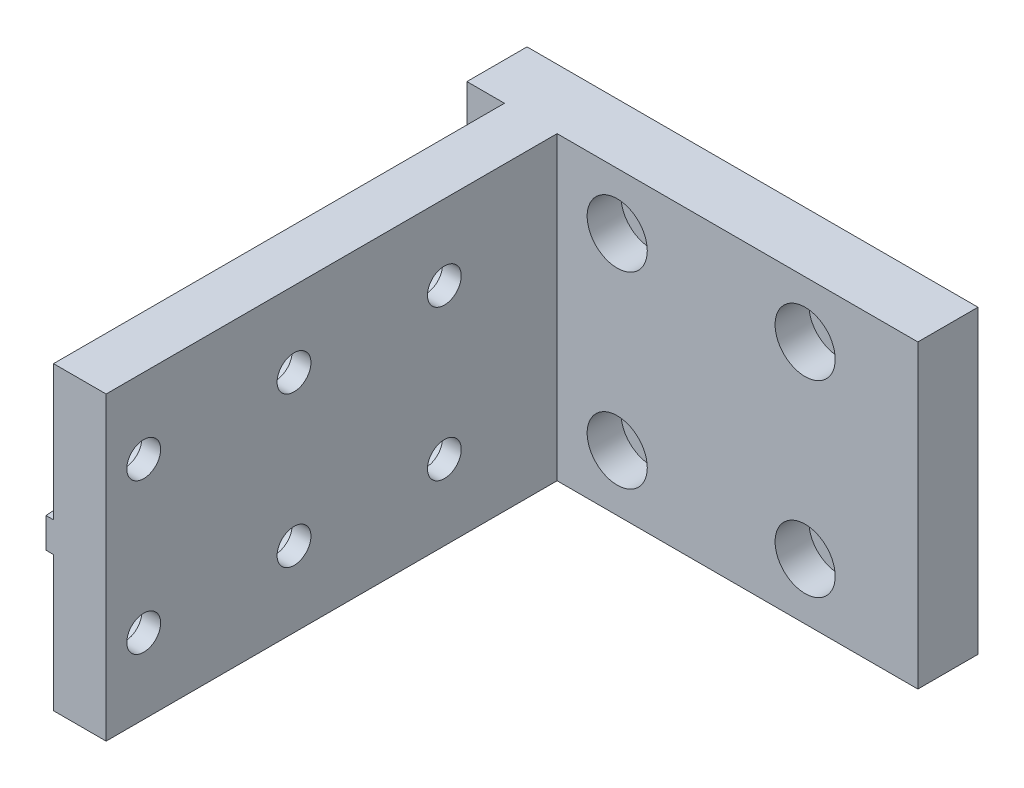
ISO-10303-21;
HEADER;
FILE_DESCRIPTION(('STEP AP214'),'2;1');
FILE_NAME('part.step','',(''),(''),'','','');
FILE_SCHEMA(('AUTOMOTIVE_DESIGN { 1 0 10303 214 1 1 1 1 }'));
ENDSEC;
DATA;
#1=APPLICATION_CONTEXT('core data for automotive mechanical design processes');
#2=APPLICATION_PROTOCOL_DEFINITION('international standard','automotive_design',2000,#1);
#3=PRODUCT_CONTEXT('',#1,'mechanical');
#4=PRODUCT('Part','Part','',(#3));
#5=PRODUCT_RELATED_PRODUCT_CATEGORY('part','',(#4));
#6=PRODUCT_DEFINITION_FORMATION('','',#4);
#7=PRODUCT_DEFINITION_CONTEXT('part definition',#1,'design');
#8=PRODUCT_DEFINITION('design','',#6,#7);
#9=PRODUCT_DEFINITION_SHAPE('','',#8);
#10=(LENGTH_UNIT() NAMED_UNIT(*) SI_UNIT(.MILLI.,.METRE.));
#11=(NAMED_UNIT(*) PLANE_ANGLE_UNIT() SI_UNIT($,.RADIAN.));
#12=(NAMED_UNIT(*) SI_UNIT($,.STERADIAN.) SOLID_ANGLE_UNIT());
#13=UNCERTAINTY_MEASURE_WITH_UNIT(LENGTH_MEASURE(1.E-05),#10,'distance_accuracy_value','');
#14=(GEOMETRIC_REPRESENTATION_CONTEXT(3) GLOBAL_UNCERTAINTY_ASSIGNED_CONTEXT((#13)) GLOBAL_UNIT_ASSIGNED_CONTEXT((#10,
#11,#12)) REPRESENTATION_CONTEXT('',''));
#15=CARTESIAN_POINT('',(0.,0.,0.));
#16=DIRECTION('',(0.,0.,1.));
#17=DIRECTION('',(1.,0.,0.));
#18=AXIS2_PLACEMENT_3D('',#15,#16,#17);
#19=CARTESIAN_POINT('',(0.,0.,8.));
#20=DIRECTION('',(0.,0.,1.));
#21=DIRECTION('',(1.,0.,0.));
#22=AXIS2_PLACEMENT_3D('',#19,#20,#21);
#23=PLANE('',#22);
#24=DIRECTION('',(0.,-1.,0.));
#25=VECTOR('',#24,1.);
#26=CARTESIAN_POINT('',(-30.,20.,8.));
#27=LINE('',#26,#25);
#28=CARTESIAN_POINT('',(-30.,20.,8.));
#29=VERTEX_POINT('',#28);
#30=CARTESIAN_POINT('',(-30.,2.,8.));
#31=VERTEX_POINT('',#30);
#32=EDGE_CURVE('E420',#29,#31,#27,.T.);
#33=ORIENTED_EDGE('',*,*,#32,.T.);
#34=DIRECTION('',(-1.,0.,0.));
#35=VECTOR('',#34,1.);
#36=CARTESIAN_POINT('',(-25.,2.,8.));
#37=LINE('',#36,#35);
#38=CARTESIAN_POINT('',(-25.,2.,8.));
#39=VERTEX_POINT('',#38);
#40=EDGE_CURVE('E167',#39,#31,#37,.T.);
#41=ORIENTED_EDGE('',*,*,#40,.F.);
#42=DIRECTION('',(0.,-1.,0.));
#43=VECTOR('',#42,1.);
#44=CARTESIAN_POINT('',(-25.,-20.,8.));
#45=LINE('',#44,#43);
#46=CARTESIAN_POINT('',(-25.,20.,8.));
#47=VERTEX_POINT('',#46);
#48=EDGE_CURVE('E428',#47,#39,#45,.T.);
#49=ORIENTED_EDGE('',*,*,#48,.F.);
#50=DIRECTION('',(-1.,0.,0.));
#51=VECTOR('',#50,1.);
#52=CARTESIAN_POINT('',(-30.,20.,8.));
#53=LINE('',#52,#51);
#54=EDGE_CURVE('E407',#47,#29,#53,.T.);
#55=ORIENTED_EDGE('',*,*,#54,.T.);
#56=EDGE_LOOP('',(#33,#41,#49,#55));
#57=FACE_BOUND('',#56,.T.);
#58=ADVANCED_FACE('F49',(#57),#23,.T.);
#59=CARTESIAN_POINT('',(-25.,-2.,8.));
#60=VERTEX_POINT('',#59);
#61=CARTESIAN_POINT('',(-25.,-20.,8.));
#62=VERTEX_POINT('',#61);
#63=EDGE_CURVE('E424',#60,#62,#45,.T.);
#64=ORIENTED_EDGE('',*,*,#63,.F.);
#65=DIRECTION('',(1.,0.,0.));
#66=VECTOR('',#65,1.);
#67=CARTESIAN_POINT('',(-30.,-2.,8.));
#68=LINE('',#67,#66);
#69=CARTESIAN_POINT('',(-30.,-2.,8.));
#70=VERTEX_POINT('',#69);
#71=EDGE_CURVE('E67',#70,#60,#68,.T.);
#72=ORIENTED_EDGE('',*,*,#71,.F.);
#73=CARTESIAN_POINT('',(-30.,-20.,8.));
#74=VERTEX_POINT('',#73);
#75=EDGE_CURVE('E412',#70,#74,#27,.T.);
#76=ORIENTED_EDGE('',*,*,#75,.T.);
#77=DIRECTION('',(1.,0.,0.));
#78=VECTOR('',#77,1.);
#79=CARTESIAN_POINT('',(-30.,-20.,8.));
#80=LINE('',#79,#78);
#81=EDGE_CURVE('E415',#74,#62,#80,.T.);
#82=ORIENTED_EDGE('',*,*,#81,.T.);
#83=EDGE_LOOP('',(#64,#72,#76,#82));
#84=FACE_BOUND('',#83,.T.);
#85=ADVANCED_FACE('F331',(#84),#23,.T.);
#86=CARTESIAN_POINT('',(-25.,-20.,68.));
#87=DIRECTION('',(1.,0.,0.));
#88=DIRECTION('',(0.,0.,-1.));
#89=AXIS2_PLACEMENT_3D('',#86,#87,#88);
#90=PLANE('',#89);
#91=CARTESIAN_POINT('',(-25.,-10.,63.));
#92=DIRECTION('',(-1.,0.,0.));
#93=DIRECTION('',(0.,0.,1.));
#94=AXIS2_PLACEMENT_3D('',#91,#92,#93);
#95=CIRCLE('',#94,4.00000000000001);
#96=CARTESIAN_POINT('',(-25.,-10.,67.));
#97=VERTEX_POINT('',#96);
#98=EDGE_CURVE('E593',#97,#97,#95,.T.);
#99=ORIENTED_EDGE('',*,*,#98,.F.);
#100=EDGE_LOOP('',(#99));
#101=FACE_BOUND('',#100,.T.);
#102=CARTESIAN_POINT('',(-25.,-10.,23.));
#103=DIRECTION('',(-1.,0.,0.));
#104=DIRECTION('',(0.,0.,1.));
#105=AXIS2_PLACEMENT_3D('',#102,#103,#104);
#106=CIRCLE('',#105,4.00000000000001);
#107=CARTESIAN_POINT('',(-25.,-10.,27.));
#108=VERTEX_POINT('',#107);
#109=EDGE_CURVE('E220',#108,#108,#106,.T.);
#110=ORIENTED_EDGE('',*,*,#109,.F.);
#111=EDGE_LOOP('',(#110));
#112=FACE_BOUND('',#111,.T.);
#113=CARTESIAN_POINT('',(-25.,-10.,43.));
#114=DIRECTION('',(-1.,0.,0.));
#115=DIRECTION('',(0.,0.,1.));
#116=AXIS2_PLACEMENT_3D('',#113,#114,#115);
#117=CIRCLE('',#116,4.00000000000001);
#118=CARTESIAN_POINT('',(-25.,-10.,47.));
#119=VERTEX_POINT('',#118);
#120=EDGE_CURVE('E623',#119,#119,#117,.T.);
#121=ORIENTED_EDGE('',*,*,#120,.F.);
#122=EDGE_LOOP('',(#121));
#123=FACE_BOUND('',#122,.T.);
#124=DIRECTION('',(0.,0.,1.));
#125=VECTOR('',#124,1.);
#126=CARTESIAN_POINT('',(-25.,-2.,8.));
#127=LINE('',#126,#125);
#128=CARTESIAN_POINT('',(-25.,-2.,68.));
#129=VERTEX_POINT('',#128);
#130=EDGE_CURVE('E169',#60,#129,#127,.T.);
#131=ORIENTED_EDGE('',*,*,#130,.F.);
#132=ORIENTED_EDGE('',*,*,#63,.T.);
#133=DIRECTION('',(0.,0.,-1.));
#134=VECTOR('',#133,1.);
#135=CARTESIAN_POINT('',(-25.,-20.,68.));
#136=LINE('',#135,#134);
#137=CARTESIAN_POINT('',(-25.,-20.,68.));
#138=VERTEX_POINT('',#137);
#139=EDGE_CURVE('E451',#138,#62,#136,.T.);
#140=ORIENTED_EDGE('',*,*,#139,.F.);
#141=DIRECTION('',(0.,-1.,0.));
#142=VECTOR('',#141,1.);
#143=CARTESIAN_POINT('',(-25.,-20.,68.));
#144=LINE('',#143,#142);
#145=EDGE_CURVE('E215',#129,#138,#144,.T.);
#146=ORIENTED_EDGE('',*,*,#145,.F.);
#147=EDGE_LOOP('',(#131,#132,#140,#146));
#148=FACE_BOUND('',#147,.T.);
#149=ADVANCED_FACE('F301',(#101,#112,#123,#148),#90,.F.);
#150=CARTESIAN_POINT('',(30.001,10.,43.));
#151=DIRECTION('',(-1.,0.,0.));
#152=DIRECTION('',(0.,0.,1.));
#153=AXIS2_PLACEMENT_3D('',#150,#151,#152);
#154=CYLINDRICAL_SURFACE('',#153,2.25);
#155=CARTESIAN_POINT('',(-18.,10.,43.));
#156=DIRECTION('',(-1.,0.,0.));
#157=DIRECTION('',(0.,-1.,0.));
#158=AXIS2_PLACEMENT_3D('',#155,#156,#157);
#159=CIRCLE('',#158,2.25);
#160=CARTESIAN_POINT('',(-18.,7.75,43.));
#161=VERTEX_POINT('',#160);
#162=EDGE_CURVE('E597',#161,#161,#159,.F.);
#163=ORIENTED_EDGE('',*,*,#162,.T.);
#164=EDGE_LOOP('',(#163));
#165=FACE_BOUND('',#164,.T.);
#166=CARTESIAN_POINT('',(-20.5,10.,43.));
#167=DIRECTION('',(-1.,0.,0.));
#168=DIRECTION('',(0.,0.,1.));
#169=AXIS2_PLACEMENT_3D('',#166,#167,#168);
#170=CIRCLE('',#169,2.25);
#171=CARTESIAN_POINT('',(-20.5,10.,45.25));
#172=VERTEX_POINT('',#171);
#173=EDGE_CURVE('E550',#172,#172,#170,.F.);
#174=ORIENTED_EDGE('',*,*,#173,.F.);
#175=EDGE_LOOP('',(#174));
#176=FACE_BOUND('',#175,.T.);
#177=ADVANCED_FACE('F290',(#165,#176),#154,.F.);
#178=CARTESIAN_POINT('',(30.001,-10.,23.));
#179=DIRECTION('',(-1.,0.,0.));
#180=DIRECTION('',(0.,0.,1.));
#181=AXIS2_PLACEMENT_3D('',#178,#179,#180);
#182=CYLINDRICAL_SURFACE('',#181,2.25);
#183=CARTESIAN_POINT('',(-18.,-10.,23.));
#184=DIRECTION('',(-1.,0.,0.));
#185=DIRECTION('',(0.,-1.,0.));
#186=AXIS2_PLACEMENT_3D('',#183,#184,#185);
#187=CIRCLE('',#186,2.25);
#188=CARTESIAN_POINT('',(-18.,-12.25,23.));
#189=VERTEX_POINT('',#188);
#190=EDGE_CURVE('E554',#189,#189,#187,.F.);
#191=ORIENTED_EDGE('',*,*,#190,.T.);
#192=EDGE_LOOP('',(#191));
#193=FACE_BOUND('',#192,.T.);
#194=CARTESIAN_POINT('',(-20.5,-10.,23.));
#195=DIRECTION('',(-1.,0.,0.));
#196=DIRECTION('',(0.,0.,1.));
#197=AXIS2_PLACEMENT_3D('',#194,#195,#196);
#198=CIRCLE('',#197,2.25);
#199=CARTESIAN_POINT('',(-20.5,-10.,25.25));
#200=VERTEX_POINT('',#199);
#201=EDGE_CURVE('E546',#200,#200,#198,.F.);
#202=ORIENTED_EDGE('',*,*,#201,.F.);
#203=EDGE_LOOP('',(#202));
#204=FACE_BOUND('',#203,.T.);
#205=ADVANCED_FACE('F286',(#193,#204),#182,.F.);
#206=CARTESIAN_POINT('',(30.001,10.,23.));
#207=DIRECTION('',(-1.,0.,0.));
#208=DIRECTION('',(0.,0.,1.));
#209=AXIS2_PLACEMENT_3D('',#206,#207,#208);
#210=CYLINDRICAL_SURFACE('',#209,2.25);
#211=CARTESIAN_POINT('',(-18.,10.,23.));
#212=DIRECTION('',(-1.,0.,0.));
#213=DIRECTION('',(0.,-1.,0.));
#214=AXIS2_PLACEMENT_3D('',#211,#212,#213);
#215=CIRCLE('',#214,2.25);
#216=CARTESIAN_POINT('',(-18.,7.75,23.));
#217=VERTEX_POINT('',#216);
#218=EDGE_CURVE('E605',#217,#217,#215,.F.);
#219=ORIENTED_EDGE('',*,*,#218,.T.);
#220=EDGE_LOOP('',(#219));
#221=FACE_BOUND('',#220,.T.);
#222=CARTESIAN_POINT('',(-20.5,10.,23.));
#223=DIRECTION('',(-1.,0.,0.));
#224=DIRECTION('',(0.,0.,1.));
#225=AXIS2_PLACEMENT_3D('',#222,#223,#224);
#226=CIRCLE('',#225,2.25);
#227=CARTESIAN_POINT('',(-20.5,10.,25.25));
#228=VERTEX_POINT('',#227);
#229=EDGE_CURVE('E541',#228,#228,#226,.F.);
#230=ORIENTED_EDGE('',*,*,#229,.F.);
#231=EDGE_LOOP('',(#230));
#232=FACE_BOUND('',#231,.T.);
#233=ADVANCED_FACE('F289',(#221,#232),#210,.F.);
#234=CARTESIAN_POINT('',(30.001,-10.,43.));
#235=DIRECTION('',(-1.,0.,0.));
#236=DIRECTION('',(0.,0.,1.));
#237=AXIS2_PLACEMENT_3D('',#234,#235,#236);
#238=CYLINDRICAL_SURFACE('',#237,2.25);
#239=CARTESIAN_POINT('',(-18.,-10.,43.));
#240=DIRECTION('',(-1.,0.,0.));
#241=DIRECTION('',(0.,-1.,0.));
#242=AXIS2_PLACEMENT_3D('',#239,#240,#241);
#243=CIRCLE('',#242,2.25);
#244=CARTESIAN_POINT('',(-18.,-12.25,43.));
#245=VERTEX_POINT('',#244);
#246=EDGE_CURVE('E601',#245,#245,#243,.F.);
#247=ORIENTED_EDGE('',*,*,#246,.T.);
#248=EDGE_LOOP('',(#247));
#249=FACE_BOUND('',#248,.T.);
#250=CARTESIAN_POINT('',(-20.5,-10.,43.));
#251=DIRECTION('',(-1.,0.,0.));
#252=DIRECTION('',(0.,0.,1.));
#253=AXIS2_PLACEMENT_3D('',#250,#251,#252);
#254=CIRCLE('',#253,2.25);
#255=CARTESIAN_POINT('',(-20.5,-10.,45.25));
#256=VERTEX_POINT('',#255);
#257=EDGE_CURVE('E537',#256,#256,#254,.F.);
#258=ORIENTED_EDGE('',*,*,#257,.F.);
#259=EDGE_LOOP('',(#258));
#260=FACE_BOUND('',#259,.T.);
#261=ADVANCED_FACE('F292',(#249,#260),#238,.F.);
#262=CARTESIAN_POINT('',(30.001,-10.,63.));
#263=DIRECTION('',(-1.,0.,0.));
#264=DIRECTION('',(0.,0.,1.));
#265=AXIS2_PLACEMENT_3D('',#262,#263,#264);
#266=CYLINDRICAL_SURFACE('',#265,2.25);
#267=CARTESIAN_POINT('',(-18.,-10.,63.));
#268=DIRECTION('',(-1.,0.,0.));
#269=DIRECTION('',(0.,-1.,0.));
#270=AXIS2_PLACEMENT_3D('',#267,#268,#269);
#271=CIRCLE('',#270,2.25);
#272=CARTESIAN_POINT('',(-18.,-12.25,63.));
#273=VERTEX_POINT('',#272);
#274=EDGE_CURVE('E536',#273,#273,#271,.F.);
#275=ORIENTED_EDGE('',*,*,#274,.T.);
#276=EDGE_LOOP('',(#275));
#277=FACE_BOUND('',#276,.T.);
#278=CARTESIAN_POINT('',(-20.5,-10.,63.));
#279=DIRECTION('',(-1.,0.,0.));
#280=DIRECTION('',(0.,0.,1.));
#281=AXIS2_PLACEMENT_3D('',#278,#279,#280);
#282=CIRCLE('',#281,2.25);
#283=CARTESIAN_POINT('',(-20.5,-10.,65.25));
#284=VERTEX_POINT('',#283);
#285=EDGE_CURVE('E531',#284,#284,#282,.F.);
#286=ORIENTED_EDGE('',*,*,#285,.F.);
#287=EDGE_LOOP('',(#286));
#288=FACE_BOUND('',#287,.T.);
#289=ADVANCED_FACE('F198',(#277,#288),#266,.F.);
#290=CARTESIAN_POINT('',(30.001,10.,63.));
#291=DIRECTION('',(-1.,0.,0.));
#292=DIRECTION('',(0.,0.,1.));
#293=AXIS2_PLACEMENT_3D('',#290,#291,#292);
#294=CYLINDRICAL_SURFACE('',#293,2.25);
#295=CARTESIAN_POINT('',(-18.,10.,63.));
#296=DIRECTION('',(-1.,0.,0.));
#297=DIRECTION('',(0.,-1.,0.));
#298=AXIS2_PLACEMENT_3D('',#295,#296,#297);
#299=CIRCLE('',#298,2.25);
#300=CARTESIAN_POINT('',(-18.,7.75,63.));
#301=VERTEX_POINT('',#300);
#302=EDGE_CURVE('E429',#301,#301,#299,.F.);
#303=ORIENTED_EDGE('',*,*,#302,.T.);
#304=EDGE_LOOP('',(#303));
#305=FACE_BOUND('',#304,.T.);
#306=CARTESIAN_POINT('',(-20.5,10.,63.));
#307=DIRECTION('',(-1.,0.,0.));
#308=DIRECTION('',(0.,0.,1.));
#309=AXIS2_PLACEMENT_3D('',#306,#307,#308);
#310=CIRCLE('',#309,2.25);
#311=CARTESIAN_POINT('',(-20.5,10.,65.25));
#312=VERTEX_POINT('',#311);
#313=EDGE_CURVE('E527',#312,#312,#310,.F.);
#314=ORIENTED_EDGE('',*,*,#313,.F.);
#315=EDGE_LOOP('',(#314));
#316=FACE_BOUND('',#315,.T.);
#317=ADVANCED_FACE('F316',(#305,#316),#294,.F.);
#318=CARTESIAN_POINT('',(15.,12.5,0.));
#319=DIRECTION('',(0.,0.,1.));
#320=DIRECTION('',(1.,0.,0.));
#321=AXIS2_PLACEMENT_3D('',#318,#319,#320);
#322=CYLINDRICAL_SURFACE('',#321,2.25);
#323=CARTESIAN_POINT('',(15.,12.5,0.));
#324=DIRECTION('',(0.,0.,1.));
#325=DIRECTION('',(1.,0.,0.));
#326=AXIS2_PLACEMENT_3D('',#323,#324,#325);
#327=CIRCLE('',#326,2.25);
#328=CARTESIAN_POINT('',(17.25,12.5,0.));
#329=VERTEX_POINT('',#328);
#330=EDGE_CURVE('E395',#329,#329,#327,.T.);
#331=ORIENTED_EDGE('',*,*,#330,.F.);
#332=EDGE_LOOP('',(#331));
#333=FACE_BOUND('',#332,.T.);
#334=CARTESIAN_POINT('',(15.,12.5,3.5));
#335=DIRECTION('',(0.,0.,1.));
#336=DIRECTION('',(1.,0.,0.));
#337=AXIS2_PLACEMENT_3D('',#334,#335,#336);
#338=CIRCLE('',#337,2.25);
#339=CARTESIAN_POINT('',(17.25,12.5,3.5));
#340=VERTEX_POINT('',#339);
#341=EDGE_CURVE('E390',#340,#340,#338,.F.);
#342=ORIENTED_EDGE('',*,*,#341,.F.);
#343=EDGE_LOOP('',(#342));
#344=FACE_BOUND('',#343,.T.);
#345=ADVANCED_FACE('F318',(#333,#344),#322,.F.);
#346=CARTESIAN_POINT('',(-9.99999999999998,-12.5,0.));
#347=DIRECTION('',(0.,0.,1.));
#348=DIRECTION('',(1.,0.,0.));
#349=AXIS2_PLACEMENT_3D('',#346,#347,#348);
#350=CYLINDRICAL_SURFACE('',#349,2.25);
#351=CARTESIAN_POINT('',(-9.99999999999998,-12.5,0.));
#352=DIRECTION('',(0.,0.,1.));
#353=DIRECTION('',(1.,0.,0.));
#354=AXIS2_PLACEMENT_3D('',#351,#352,#353);
#355=CIRCLE('',#354,2.25);
#356=CARTESIAN_POINT('',(-7.74999999999998,-12.5,0.));
#357=VERTEX_POINT('',#356);
#358=EDGE_CURVE('E385',#357,#357,#355,.T.);
#359=ORIENTED_EDGE('',*,*,#358,.F.);
#360=EDGE_LOOP('',(#359));
#361=FACE_BOUND('',#360,.T.);
#362=CARTESIAN_POINT('',(-9.99999999999998,-12.5,3.5));
#363=DIRECTION('',(0.,0.,1.));
#364=DIRECTION('',(1.,0.,0.));
#365=AXIS2_PLACEMENT_3D('',#362,#363,#364);
#366=CIRCLE('',#365,2.25);
#367=CARTESIAN_POINT('',(-7.74999999999998,-12.5,3.5));
#368=VERTEX_POINT('',#367);
#369=EDGE_CURVE('E515',#368,#368,#366,.F.);
#370=ORIENTED_EDGE('',*,*,#369,.F.);
#371=EDGE_LOOP('',(#370));
#372=FACE_BOUND('',#371,.T.);
#373=ADVANCED_FACE('F324',(#361,#372),#350,.F.);
#374=CARTESIAN_POINT('',(-9.99999999999998,12.5,0.));
#375=DIRECTION('',(0.,0.,1.));
#376=DIRECTION('',(1.,0.,0.));
#377=AXIS2_PLACEMENT_3D('',#374,#375,#376);
#378=CYLINDRICAL_SURFACE('',#377,2.25);
#379=CARTESIAN_POINT('',(-9.99999999999998,12.5,0.));
#380=DIRECTION('',(0.,0.,1.));
#381=DIRECTION('',(1.,0.,0.));
#382=AXIS2_PLACEMENT_3D('',#379,#380,#381);
#383=CIRCLE('',#382,2.25);
#384=CARTESIAN_POINT('',(-7.74999999999999,12.5,0.));
#385=VERTEX_POINT('',#384);
#386=EDGE_CURVE('E389',#385,#385,#383,.T.);
#387=ORIENTED_EDGE('',*,*,#386,.F.);
#388=EDGE_LOOP('',(#387));
#389=FACE_BOUND('',#388,.T.);
#390=CARTESIAN_POINT('',(-9.99999999999998,12.5,3.5));
#391=DIRECTION('',(0.,0.,1.));
#392=DIRECTION('',(1.,0.,0.));
#393=AXIS2_PLACEMENT_3D('',#390,#391,#392);
#394=CIRCLE('',#393,2.25);
#395=CARTESIAN_POINT('',(-7.74999999999999,12.5,3.5));
#396=VERTEX_POINT('',#395);
#397=EDGE_CURVE('E512',#396,#396,#394,.F.);
#398=ORIENTED_EDGE('',*,*,#397,.F.);
#399=EDGE_LOOP('',(#398));
#400=FACE_BOUND('',#399,.T.);
#401=ADVANCED_FACE('F498',(#389,#400),#378,.F.);
#402=CARTESIAN_POINT('',(15.,-12.5,0.));
#403=DIRECTION('',(0.,0.,1.));
#404=DIRECTION('',(1.,0.,0.));
#405=AXIS2_PLACEMENT_3D('',#402,#403,#404);
#406=CYLINDRICAL_SURFACE('',#405,2.25);
#407=CARTESIAN_POINT('',(15.,-12.5,0.));
#408=DIRECTION('',(0.,0.,1.));
#409=DIRECTION('',(1.,0.,0.));
#410=AXIS2_PLACEMENT_3D('',#407,#408,#409);
#411=CIRCLE('',#410,2.25);
#412=CARTESIAN_POINT('',(17.25,-12.5,0.));
#413=VERTEX_POINT('',#412);
#414=EDGE_CURVE('E391',#413,#413,#411,.T.);
#415=ORIENTED_EDGE('',*,*,#414,.F.);
#416=EDGE_LOOP('',(#415));
#417=FACE_BOUND('',#416,.T.);
#418=CARTESIAN_POINT('',(15.,-12.5,3.5));
#419=DIRECTION('',(0.,0.,1.));
#420=DIRECTION('',(1.,0.,0.));
#421=AXIS2_PLACEMENT_3D('',#418,#419,#420);
#422=CIRCLE('',#421,2.25);
#423=CARTESIAN_POINT('',(17.25,-12.5,3.5));
#424=VERTEX_POINT('',#423);
#425=EDGE_CURVE('E379',#424,#424,#422,.F.);
#426=ORIENTED_EDGE('',*,*,#425,.F.);
#427=EDGE_LOOP('',(#426));
#428=FACE_BOUND('',#427,.T.);
#429=ADVANCED_FACE('F500',(#417,#428),#406,.F.);
#430=CARTESIAN_POINT('',(30.,20.,8.));
#431=DIRECTION('',(-1.,0.,0.));
#432=DIRECTION('',(0.,-1.,0.));
#433=AXIS2_PLACEMENT_3D('',#430,#431,#432);
#434=PLANE('',#433);
#435=DIRECTION('',(0.,1.,0.));
#436=VECTOR('',#435,1.);
#437=CARTESIAN_POINT('',(30.,20.,0.));
#438=LINE('',#437,#436);
#439=CARTESIAN_POINT('',(30.,-20.,0.));
#440=VERTEX_POINT('',#439);
#441=CARTESIAN_POINT('',(30.,20.,0.));
#442=VERTEX_POINT('',#441);
#443=EDGE_CURVE('E402',#440,#442,#438,.T.);
#444=ORIENTED_EDGE('',*,*,#443,.T.);
#445=DIRECTION('',(0.,0.,-1.));
#446=VECTOR('',#445,1.);
#447=CARTESIAN_POINT('',(30.,20.,8.));
#448=LINE('',#447,#446);
#449=CARTESIAN_POINT('',(30.,20.,8.));
#450=VERTEX_POINT('',#449);
#451=EDGE_CURVE('E12',#450,#442,#448,.T.);
#452=ORIENTED_EDGE('',*,*,#451,.F.);
#453=DIRECTION('',(0.,1.,0.));
#454=VECTOR('',#453,1.);
#455=CARTESIAN_POINT('',(30.,20.,8.));
#456=LINE('',#455,#454);
#457=CARTESIAN_POINT('',(30.,-20.,8.));
#458=VERTEX_POINT('',#457);
#459=EDGE_CURVE('E403',#458,#450,#456,.T.);
#460=ORIENTED_EDGE('',*,*,#459,.F.);
#461=DIRECTION('',(0.,0.,-1.));
#462=VECTOR('',#461,1.);
#463=CARTESIAN_POINT('',(30.,-20.,8.));
#464=LINE('',#463,#462);
#465=EDGE_CURVE('E967',#458,#440,#464,.T.);
#466=ORIENTED_EDGE('',*,*,#465,.T.);
#467=EDGE_LOOP('',(#444,#452,#460,#466));
#468=FACE_BOUND('',#467,.T.);
#469=ADVANCED_FACE('F51',(#468),#434,.F.);
#470=CARTESIAN_POINT('',(-30.,20.,8.));
#471=DIRECTION('',(0.,-1.,0.));
#472=DIRECTION('',(0.,0.,-1.));
#473=AXIS2_PLACEMENT_3D('',#470,#471,#472);
#474=PLANE('',#473);
#475=DIRECTION('',(-1.,0.,0.));
#476=VECTOR('',#475,1.);
#477=CARTESIAN_POINT('',(-30.,20.,0.));
#478=LINE('',#477,#476);
#479=CARTESIAN_POINT('',(-30.,20.,0.));
#480=VERTEX_POINT('',#479);
#481=EDGE_CURVE('E971',#442,#480,#478,.T.);
#482=ORIENTED_EDGE('',*,*,#481,.T.);
#483=DIRECTION('',(0.,0.,-1.));
#484=VECTOR('',#483,1.);
#485=CARTESIAN_POINT('',(-30.,20.,8.));
#486=LINE('',#485,#484);
#487=EDGE_CURVE('E59',#29,#480,#486,.T.);
#488=ORIENTED_EDGE('',*,*,#487,.F.);
#489=ORIENTED_EDGE('',*,*,#54,.F.);
#490=DIRECTION('',(0.,0.,-1.));
#491=VECTOR('',#490,1.);
#492=CARTESIAN_POINT('',(-25.,20.,68.));
#493=LINE('',#492,#491);
#494=CARTESIAN_POINT('',(-25.,20.,68.));
#495=VERTEX_POINT('',#494);
#496=EDGE_CURVE('E439',#495,#47,#493,.T.);
#497=ORIENTED_EDGE('',*,*,#496,.F.);
#498=DIRECTION('',(-1.,0.,0.));
#499=VECTOR('',#498,1.);
#500=CARTESIAN_POINT('',(-25.,20.,68.));
#501=LINE('',#500,#499);
#502=CARTESIAN_POINT('',(-18.,20.,68.));
#503=VERTEX_POINT('',#502);
#504=EDGE_CURVE('E434',#503,#495,#501,.T.);
#505=ORIENTED_EDGE('',*,*,#504,.F.);
#506=DIRECTION('',(0.,0.,-1.));
#507=VECTOR('',#506,1.);
#508=CARTESIAN_POINT('',(-18.,20.,68.));
#509=LINE('',#508,#507);
#510=CARTESIAN_POINT('',(-18.,20.,8.));
#511=VERTEX_POINT('',#510);
#512=EDGE_CURVE('E443',#503,#511,#509,.T.);
#513=ORIENTED_EDGE('',*,*,#512,.T.);
#514=EDGE_CURVE('E409',#450,#511,#53,.T.);
#515=ORIENTED_EDGE('',*,*,#514,.F.);
#516=ORIENTED_EDGE('',*,*,#451,.T.);
#517=EDGE_LOOP('',(#482,#488,#489,#497,#505,#513,#515,#516));
#518=FACE_BOUND('',#517,.T.);
#519=ADVANCED_FACE('F573',(#518),#474,.F.);
#520=CARTESIAN_POINT('',(-30.,20.,8.));
#521=DIRECTION('',(1.,0.,0.));
#522=DIRECTION('',(0.,1.,0.));
#523=AXIS2_PLACEMENT_3D('',#520,#521,#522);
#524=PLANE('',#523);
#525=DIRECTION('',(0.,-1.,0.));
#526=VECTOR('',#525,1.);
#527=CARTESIAN_POINT('',(-30.,20.,0.));
#528=LINE('',#527,#526);
#529=CARTESIAN_POINT('',(-30.,-20.,0.));
#530=VERTEX_POINT('',#529);
#531=EDGE_CURVE('E973',#480,#530,#528,.T.);
#532=ORIENTED_EDGE('',*,*,#531,.T.);
#533=DIRECTION('',(0.,0.,-1.));
#534=VECTOR('',#533,1.);
#535=CARTESIAN_POINT('',(-30.,-20.,8.));
#536=LINE('',#535,#534);
#537=EDGE_CURVE('E982',#74,#530,#536,.T.);
#538=ORIENTED_EDGE('',*,*,#537,.F.);
#539=ORIENTED_EDGE('',*,*,#75,.F.);
#540=DIRECTION('',(0.,-1.,0.));
#541=VECTOR('',#540,1.);
#542=CARTESIAN_POINT('',(-30.,2.,8.));
#543=LINE('',#542,#541);
#544=EDGE_CURVE('E74',#31,#70,#543,.T.);
#545=ORIENTED_EDGE('',*,*,#544,.F.);
#546=ORIENTED_EDGE('',*,*,#32,.F.);
#547=ORIENTED_EDGE('',*,*,#487,.T.);
#548=EDGE_LOOP('',(#532,#538,#539,#545,#546,#547));
#549=FACE_BOUND('',#548,.T.);
#550=ADVANCED_FACE('F349',(#549),#524,.F.);
#551=CARTESIAN_POINT('',(-30.,-20.,8.));
#552=DIRECTION('',(0.,1.,0.));
#553=DIRECTION('',(0.,0.,1.));
#554=AXIS2_PLACEMENT_3D('',#551,#552,#553);
#555=PLANE('',#554);
#556=DIRECTION('',(1.,0.,0.));
#557=VECTOR('',#556,1.);
#558=CARTESIAN_POINT('',(-30.,-20.,0.));
#559=LINE('',#558,#557);
#560=EDGE_CURVE('E408',#530,#440,#559,.T.);
#561=ORIENTED_EDGE('',*,*,#560,.T.);
#562=ORIENTED_EDGE('',*,*,#465,.F.);
#563=CARTESIAN_POINT('',(-18.,-20.,8.));
#564=VERTEX_POINT('',#563);
#565=EDGE_CURVE('E423',#564,#458,#80,.T.);
#566=ORIENTED_EDGE('',*,*,#565,.F.);
#567=DIRECTION('',(0.,0.,-1.));
#568=VECTOR('',#567,1.);
#569=CARTESIAN_POINT('',(-18.,-20.,68.));
#570=LINE('',#569,#568);
#571=CARTESIAN_POINT('',(-18.,-20.,68.));
#572=VERTEX_POINT('',#571);
#573=EDGE_CURVE('E447',#572,#564,#570,.T.);
#574=ORIENTED_EDGE('',*,*,#573,.F.);
#575=DIRECTION('',(1.,0.,0.));
#576=VECTOR('',#575,1.);
#577=CARTESIAN_POINT('',(-18.,-20.,68.));
#578=LINE('',#577,#576);
#579=EDGE_CURVE('E557',#138,#572,#578,.T.);
#580=ORIENTED_EDGE('',*,*,#579,.F.);
#581=ORIENTED_EDGE('',*,*,#139,.T.);
#582=ORIENTED_EDGE('',*,*,#81,.F.);
#583=ORIENTED_EDGE('',*,*,#537,.T.);
#584=EDGE_LOOP('',(#561,#562,#566,#574,#580,#581,#582,#583));
#585=FACE_BOUND('',#584,.T.);
#586=ADVANCED_FACE('F341',(#585),#555,.F.);
#587=DIRECTION('',(0.,1.,0.));
#588=VECTOR('',#587,1.);
#589=CARTESIAN_POINT('',(-18.,20.,8.));
#590=LINE('',#589,#588);
#591=EDGE_CURVE('E354',#564,#511,#590,.T.);
#592=ORIENTED_EDGE('',*,*,#591,.F.);
#593=ORIENTED_EDGE('',*,*,#565,.T.);
#594=ORIENTED_EDGE('',*,*,#459,.T.);
#595=ORIENTED_EDGE('',*,*,#514,.T.);
#596=EDGE_LOOP('',(#592,#593,#594,#595));
#597=FACE_BOUND('',#596,.T.);
#598=CARTESIAN_POINT('',(15.,-12.5,8.));
#599=DIRECTION('',(0.,0.,1.));
#600=DIRECTION('',(1.,0.,0.));
#601=AXIS2_PLACEMENT_3D('',#598,#599,#600);
#602=CIRCLE('',#601,4.);
#603=CARTESIAN_POINT('',(19.,-12.5,8.));
#604=VERTEX_POINT('',#603);
#605=EDGE_CURVE('E359',#604,#604,#602,.T.);
#606=ORIENTED_EDGE('',*,*,#605,.F.);
#607=EDGE_LOOP('',(#606));
#608=FACE_BOUND('',#607,.T.);
#609=CARTESIAN_POINT('',(-9.99999999999998,12.5,8.));
#610=DIRECTION('',(0.,0.,1.));
#611=DIRECTION('',(1.,0.,0.));
#612=AXIS2_PLACEMENT_3D('',#609,#610,#611);
#613=CIRCLE('',#612,4.);
#614=CARTESIAN_POINT('',(-5.99999999999998,12.5,8.));
#615=VERTEX_POINT('',#614);
#616=EDGE_CURVE('E363',#615,#615,#613,.T.);
#617=ORIENTED_EDGE('',*,*,#616,.F.);
#618=EDGE_LOOP('',(#617));
#619=FACE_BOUND('',#618,.T.);
#620=CARTESIAN_POINT('',(-9.99999999999998,-12.5,8.));
#621=DIRECTION('',(0.,0.,1.));
#622=DIRECTION('',(1.,0.,0.));
#623=AXIS2_PLACEMENT_3D('',#620,#621,#622);
#624=CIRCLE('',#623,4.);
#625=CARTESIAN_POINT('',(-5.99999999999998,-12.5,8.));
#626=VERTEX_POINT('',#625);
#627=EDGE_CURVE('E367',#626,#626,#624,.T.);
#628=ORIENTED_EDGE('',*,*,#627,.F.);
#629=EDGE_LOOP('',(#628));
#630=FACE_BOUND('',#629,.T.);
#631=CARTESIAN_POINT('',(15.,12.5,8.));
#632=DIRECTION('',(0.,0.,1.));
#633=DIRECTION('',(1.,0.,0.));
#634=AXIS2_PLACEMENT_3D('',#631,#632,#633);
#635=CIRCLE('',#634,4.);
#636=CARTESIAN_POINT('',(19.,12.5,8.));
#637=VERTEX_POINT('',#636);
#638=EDGE_CURVE('E370',#637,#637,#635,.T.);
#639=ORIENTED_EDGE('',*,*,#638,.F.);
#640=EDGE_LOOP('',(#639));
#641=FACE_BOUND('',#640,.T.);
#642=ADVANCED_FACE('F334',(#597,#608,#619,#630,#641),#23,.T.);
#643=CARTESIAN_POINT('',(0.,0.,0.));
#644=DIRECTION('',(0.,0.,1.));
#645=DIRECTION('',(1.,0.,0.));
#646=AXIS2_PLACEMENT_3D('',#643,#644,#645);
#647=PLANE('',#646);
#648=ORIENTED_EDGE('',*,*,#414,.T.);
#649=EDGE_LOOP('',(#648));
#650=FACE_BOUND('',#649,.T.);
#651=ORIENTED_EDGE('',*,*,#386,.T.);
#652=EDGE_LOOP('',(#651));
#653=FACE_BOUND('',#652,.T.);
#654=ORIENTED_EDGE('',*,*,#358,.T.);
#655=EDGE_LOOP('',(#654));
#656=FACE_BOUND('',#655,.T.);
#657=ORIENTED_EDGE('',*,*,#330,.T.);
#658=EDGE_LOOP('',(#657));
#659=FACE_BOUND('',#658,.T.);
#660=ORIENTED_EDGE('',*,*,#443,.F.);
#661=ORIENTED_EDGE('',*,*,#560,.F.);
#662=ORIENTED_EDGE('',*,*,#531,.F.);
#663=ORIENTED_EDGE('',*,*,#481,.F.);
#664=EDGE_LOOP('',(#660,#661,#662,#663));
#665=FACE_BOUND('',#664,.T.);
#666=ADVANCED_FACE('F340',(#650,#653,#656,#659,#665),#647,.F.);
#667=CARTESIAN_POINT('',(15.,-12.5,3.5));
#668=DIRECTION('',(0.,0.,1.));
#669=DIRECTION('',(1.,0.,0.));
#670=AXIS2_PLACEMENT_3D('',#667,#668,#669);
#671=PLANE('',#670);
#672=CARTESIAN_POINT('',(15.,-12.5,3.5));
#673=DIRECTION('',(0.,0.,1.));
#674=DIRECTION('',(1.,0.,0.));
#675=AXIS2_PLACEMENT_3D('',#672,#673,#674);
#676=CIRCLE('',#675,4.);
#677=CARTESIAN_POINT('',(19.,-12.5,3.5));
#678=VERTEX_POINT('',#677);
#679=EDGE_CURVE('E374',#678,#678,#676,.T.);
#680=ORIENTED_EDGE('',*,*,#679,.T.);
#681=EDGE_LOOP('',(#680));
#682=FACE_BOUND('',#681,.T.);
#683=ORIENTED_EDGE('',*,*,#425,.T.);
#684=EDGE_LOOP('',(#683));
#685=FACE_BOUND('',#684,.T.);
#686=ADVANCED_FACE('F347',(#682,#685),#671,.T.);
#687=CARTESIAN_POINT('',(15.,-12.5,3.5));
#688=DIRECTION('',(0.,0.,1.));
#689=DIRECTION('',(1.,0.,0.));
#690=AXIS2_PLACEMENT_3D('',#687,#688,#689);
#691=CYLINDRICAL_SURFACE('',#690,4.);
#692=ORIENTED_EDGE('',*,*,#679,.F.);
#693=EDGE_LOOP('',(#692));
#694=FACE_BOUND('',#693,.T.);
#695=ORIENTED_EDGE('',*,*,#605,.T.);
#696=EDGE_LOOP('',(#695));
#697=FACE_BOUND('',#696,.T.);
#698=ADVANCED_FACE('F481',(#694,#697),#691,.F.);
#699=CARTESIAN_POINT('',(-9.99999999999998,12.5,3.5));
#700=DIRECTION('',(0.,0.,1.));
#701=DIRECTION('',(1.,0.,0.));
#702=AXIS2_PLACEMENT_3D('',#699,#700,#701);
#703=PLANE('',#702);
#704=CARTESIAN_POINT('',(-9.99999999999998,12.5,3.5));
#705=DIRECTION('',(0.,0.,1.));
#706=DIRECTION('',(1.,0.,0.));
#707=AXIS2_PLACEMENT_3D('',#704,#705,#706);
#708=CIRCLE('',#707,4.);
#709=CARTESIAN_POINT('',(-5.99999999999998,12.5,3.5));
#710=VERTEX_POINT('',#709);
#711=EDGE_CURVE('E463',#710,#710,#708,.T.);
#712=ORIENTED_EDGE('',*,*,#711,.T.);
#713=EDGE_LOOP('',(#712));
#714=FACE_BOUND('',#713,.T.);
#715=ORIENTED_EDGE('',*,*,#397,.T.);
#716=EDGE_LOOP('',(#715));
#717=FACE_BOUND('',#716,.T.);
#718=ADVANCED_FACE('F471',(#714,#717),#703,.T.);
#719=CARTESIAN_POINT('',(-9.99999999999998,12.5,3.5));
#720=DIRECTION('',(0.,0.,1.));
#721=DIRECTION('',(1.,0.,0.));
#722=AXIS2_PLACEMENT_3D('',#719,#720,#721);
#723=CYLINDRICAL_SURFACE('',#722,4.);
#724=ORIENTED_EDGE('',*,*,#711,.F.);
#725=EDGE_LOOP('',(#724));
#726=FACE_BOUND('',#725,.T.);
#727=ORIENTED_EDGE('',*,*,#616,.T.);
#728=EDGE_LOOP('',(#727));
#729=FACE_BOUND('',#728,.T.);
#730=ADVANCED_FACE('F468',(#726,#729),#723,.F.);
#731=CARTESIAN_POINT('',(-9.99999999999998,-12.5,3.5));
#732=DIRECTION('',(0.,0.,1.));
#733=DIRECTION('',(1.,0.,0.));
#734=AXIS2_PLACEMENT_3D('',#731,#732,#733);
#735=PLANE('',#734);
#736=CARTESIAN_POINT('',(-9.99999999999998,-12.5,3.5));
#737=DIRECTION('',(0.,0.,1.));
#738=DIRECTION('',(1.,0.,0.));
#739=AXIS2_PLACEMENT_3D('',#736,#737,#738);
#740=CIRCLE('',#739,4.);
#741=CARTESIAN_POINT('',(-5.99999999999998,-12.5,3.5));
#742=VERTEX_POINT('',#741);
#743=EDGE_CURVE('E455',#742,#742,#740,.T.);
#744=ORIENTED_EDGE('',*,*,#743,.T.);
#745=EDGE_LOOP('',(#744));
#746=FACE_BOUND('',#745,.T.);
#747=ORIENTED_EDGE('',*,*,#369,.T.);
#748=EDGE_LOOP('',(#747));
#749=FACE_BOUND('',#748,.T.);
#750=ADVANCED_FACE('F470',(#746,#749),#735,.T.);
#751=CARTESIAN_POINT('',(-9.99999999999998,-12.5,3.5));
#752=DIRECTION('',(0.,0.,1.));
#753=DIRECTION('',(1.,0.,0.));
#754=AXIS2_PLACEMENT_3D('',#751,#752,#753);
#755=CYLINDRICAL_SURFACE('',#754,4.);
#756=ORIENTED_EDGE('',*,*,#743,.F.);
#757=EDGE_LOOP('',(#756));
#758=FACE_BOUND('',#757,.T.);
#759=ORIENTED_EDGE('',*,*,#627,.T.);
#760=EDGE_LOOP('',(#759));
#761=FACE_BOUND('',#760,.T.);
#762=ADVANCED_FACE('F478',(#758,#761),#755,.F.);
#763=CARTESIAN_POINT('',(15.,12.5,3.5));
#764=DIRECTION('',(0.,0.,1.));
#765=DIRECTION('',(1.,0.,0.));
#766=AXIS2_PLACEMENT_3D('',#763,#764,#765);
#767=PLANE('',#766);
#768=CARTESIAN_POINT('',(15.,12.5,3.5));
#769=DIRECTION('',(0.,0.,1.));
#770=DIRECTION('',(1.,0.,0.));
#771=AXIS2_PLACEMENT_3D('',#768,#769,#770);
#772=CIRCLE('',#771,4.);
#773=CARTESIAN_POINT('',(19.,12.5,3.5));
#774=VERTEX_POINT('',#773);
#775=EDGE_CURVE('E373',#774,#774,#772,.T.);
#776=ORIENTED_EDGE('',*,*,#775,.T.);
#777=EDGE_LOOP('',(#776));
#778=FACE_BOUND('',#777,.T.);
#779=ORIENTED_EDGE('',*,*,#341,.T.);
#780=EDGE_LOOP('',(#779));
#781=FACE_BOUND('',#780,.T.);
#782=ADVANCED_FACE('F487',(#778,#781),#767,.T.);
#783=CARTESIAN_POINT('',(15.,12.5,3.5));
#784=DIRECTION('',(0.,0.,1.));
#785=DIRECTION('',(1.,0.,0.));
#786=AXIS2_PLACEMENT_3D('',#783,#784,#785);
#787=CYLINDRICAL_SURFACE('',#786,4.);
#788=ORIENTED_EDGE('',*,*,#775,.F.);
#789=EDGE_LOOP('',(#788));
#790=FACE_BOUND('',#789,.T.);
#791=ORIENTED_EDGE('',*,*,#638,.T.);
#792=EDGE_LOOP('',(#791));
#793=FACE_BOUND('',#792,.T.);
#794=ADVANCED_FACE('F490',(#790,#793),#787,.F.);
#795=CARTESIAN_POINT('',(-25.,10.,23.));
#796=DIRECTION('',(-1.,0.,0.));
#797=DIRECTION('',(0.,0.,1.));
#798=AXIS2_PLACEMENT_3D('',#795,#796,#797);
#799=CIRCLE('',#798,4.00000000000001);
#800=CARTESIAN_POINT('',(-25.,10.,27.));
#801=VERTEX_POINT('',#800);
#802=EDGE_CURVE('E631',#801,#801,#799,.T.);
#803=ORIENTED_EDGE('',*,*,#802,.F.);
#804=EDGE_LOOP('',(#803));
#805=FACE_BOUND('',#804,.T.);
#806=CARTESIAN_POINT('',(-25.,10.,43.));
#807=DIRECTION('',(-1.,0.,0.));
#808=DIRECTION('',(0.,0.,1.));
#809=AXIS2_PLACEMENT_3D('',#806,#807,#808);
#810=CIRCLE('',#809,4.00000000000001);
#811=CARTESIAN_POINT('',(-25.,10.,47.));
#812=VERTEX_POINT('',#811);
#813=EDGE_CURVE('E615',#812,#812,#810,.T.);
#814=ORIENTED_EDGE('',*,*,#813,.F.);
#815=EDGE_LOOP('',(#814));
#816=FACE_BOUND('',#815,.T.);
#817=CARTESIAN_POINT('',(-25.,10.,63.));
#818=DIRECTION('',(-1.,0.,0.));
#819=DIRECTION('',(0.,0.,1.));
#820=AXIS2_PLACEMENT_3D('',#817,#818,#819);
#821=CIRCLE('',#820,4.00000000000001);
#822=CARTESIAN_POINT('',(-25.,10.,67.));
#823=VERTEX_POINT('',#822);
#824=EDGE_CURVE('E585',#823,#823,#821,.T.);
#825=ORIENTED_EDGE('',*,*,#824,.F.);
#826=EDGE_LOOP('',(#825));
#827=FACE_BOUND('',#826,.T.);
#828=ORIENTED_EDGE('',*,*,#48,.T.);
#829=DIRECTION('',(0.,0.,1.));
#830=VECTOR('',#829,1.);
#831=CARTESIAN_POINT('',(-25.,2.,8.));
#832=LINE('',#831,#830);
#833=CARTESIAN_POINT('',(-25.,2.,68.));
#834=VERTEX_POINT('',#833);
#835=EDGE_CURVE('E177',#39,#834,#832,.T.);
#836=ORIENTED_EDGE('',*,*,#835,.T.);
#837=EDGE_CURVE('E175',#495,#834,#144,.T.);
#838=ORIENTED_EDGE('',*,*,#837,.F.);
#839=ORIENTED_EDGE('',*,*,#496,.T.);
#840=EDGE_LOOP('',(#828,#836,#838,#839));
#841=FACE_BOUND('',#840,.T.);
#842=ADVANCED_FACE('F494',(#805,#816,#827,#841),#90,.F.);
#843=CARTESIAN_POINT('',(-18.,20.,68.));
#844=DIRECTION('',(-1.,0.,0.));
#845=DIRECTION('',(0.,-1.,0.));
#846=AXIS2_PLACEMENT_3D('',#843,#844,#845);
#847=PLANE('',#846);
#848=ORIENTED_EDGE('',*,*,#246,.F.);
#849=EDGE_LOOP('',(#848));
#850=FACE_BOUND('',#849,.T.);
#851=ORIENTED_EDGE('',*,*,#218,.F.);
#852=EDGE_LOOP('',(#851));
#853=FACE_BOUND('',#852,.T.);
#854=ORIENTED_EDGE('',*,*,#190,.F.);
#855=EDGE_LOOP('',(#854));
#856=FACE_BOUND('',#855,.T.);
#857=ORIENTED_EDGE('',*,*,#162,.F.);
#858=EDGE_LOOP('',(#857));
#859=FACE_BOUND('',#858,.T.);
#860=ORIENTED_EDGE('',*,*,#302,.F.);
#861=EDGE_LOOP('',(#860));
#862=FACE_BOUND('',#861,.T.);
#863=ORIENTED_EDGE('',*,*,#274,.F.);
#864=EDGE_LOOP('',(#863));
#865=FACE_BOUND('',#864,.T.);
#866=ORIENTED_EDGE('',*,*,#591,.T.);
#867=ORIENTED_EDGE('',*,*,#512,.F.);
#868=DIRECTION('',(0.,1.,0.));
#869=VECTOR('',#868,1.);
#870=CARTESIAN_POINT('',(-18.,20.,68.));
#871=LINE('',#870,#869);
#872=EDGE_CURVE('E564',#572,#503,#871,.T.);
#873=ORIENTED_EDGE('',*,*,#872,.F.);
#874=ORIENTED_EDGE('',*,*,#573,.T.);
#875=EDGE_LOOP('',(#866,#867,#873,#874));
#876=FACE_BOUND('',#875,.T.);
#877=ADVANCED_FACE('F197',(#850,#853,#856,#859,#862,#865,#876),#847,.F.);
#878=CARTESIAN_POINT('',(0.,0.,68.));
#879=DIRECTION('',(0.,0.,-1.));
#880=DIRECTION('',(-1.,0.,0.));
#881=AXIS2_PLACEMENT_3D('',#878,#879,#880);
#882=PLANE('',#881);
#883=ORIENTED_EDGE('',*,*,#837,.T.);
#884=DIRECTION('',(-1.,0.,0.));
#885=VECTOR('',#884,1.);
#886=CARTESIAN_POINT('',(-25.,2.,68.));
#887=LINE('',#886,#885);
#888=CARTESIAN_POINT('',(-26.,2.,68.));
#889=VERTEX_POINT('',#888);
#890=EDGE_CURVE('E157',#834,#889,#887,.T.);
#891=ORIENTED_EDGE('',*,*,#890,.T.);
#892=DIRECTION('',(0.,-1.,0.));
#893=VECTOR('',#892,1.);
#894=CARTESIAN_POINT('',(-26.,2.,68.));
#895=LINE('',#894,#893);
#896=CARTESIAN_POINT('',(-26.,-2.,68.));
#897=VERTEX_POINT('',#896);
#898=EDGE_CURVE('E143',#889,#897,#895,.T.);
#899=ORIENTED_EDGE('',*,*,#898,.T.);
#900=DIRECTION('',(1.,0.,0.));
#901=VECTOR('',#900,1.);
#902=CARTESIAN_POINT('',(-26.,-2.,68.));
#903=LINE('',#902,#901);
#904=EDGE_CURVE('E156',#897,#129,#903,.T.);
#905=ORIENTED_EDGE('',*,*,#904,.T.);
#906=ORIENTED_EDGE('',*,*,#145,.T.);
#907=ORIENTED_EDGE('',*,*,#579,.T.);
#908=ORIENTED_EDGE('',*,*,#872,.T.);
#909=ORIENTED_EDGE('',*,*,#504,.T.);
#910=EDGE_LOOP('',(#883,#891,#899,#905,#906,#907,#908,#909));
#911=FACE_BOUND('',#910,.T.);
#912=ADVANCED_FACE('F173',(#911),#882,.F.);
#913=CARTESIAN_POINT('',(-20.5,10.,63.));
#914=DIRECTION('',(-1.,0.,0.));
#915=DIRECTION('',(0.,0.,1.));
#916=AXIS2_PLACEMENT_3D('',#913,#914,#915);
#917=PLANE('',#916);
#918=CARTESIAN_POINT('',(-20.5,10.,63.));
#919=DIRECTION('',(-1.,0.,0.));
#920=DIRECTION('',(0.,0.,1.));
#921=AXIS2_PLACEMENT_3D('',#918,#919,#920);
#922=CIRCLE('',#921,4.00000000000001);
#923=CARTESIAN_POINT('',(-20.5,10.,67.));
#924=VERTEX_POINT('',#923);
#925=EDGE_CURVE('E532',#924,#924,#922,.T.);
#926=ORIENTED_EDGE('',*,*,#925,.T.);
#927=EDGE_LOOP('',(#926));
#928=FACE_BOUND('',#927,.T.);
#929=ORIENTED_EDGE('',*,*,#313,.T.);
#930=EDGE_LOOP('',(#929));
#931=FACE_BOUND('',#930,.T.);
#932=ADVANCED_FACE('F196',(#928,#931),#917,.T.);
#933=CARTESIAN_POINT('',(-20.5,10.,63.));
#934=DIRECTION('',(-1.,0.,0.));
#935=DIRECTION('',(0.,0.,1.));
#936=AXIS2_PLACEMENT_3D('',#933,#934,#935);
#937=CYLINDRICAL_SURFACE('',#936,4.00000000000001);
#938=ORIENTED_EDGE('',*,*,#925,.F.);
#939=EDGE_LOOP('',(#938));
#940=FACE_BOUND('',#939,.T.);
#941=ORIENTED_EDGE('',*,*,#824,.T.);
#942=EDGE_LOOP('',(#941));
#943=FACE_BOUND('',#942,.T.);
#944=ADVANCED_FACE('F305',(#940,#943),#937,.F.);
#945=CARTESIAN_POINT('',(-20.5,-10.,63.));
#946=DIRECTION('',(-1.,0.,0.));
#947=DIRECTION('',(0.,0.,1.));
#948=AXIS2_PLACEMENT_3D('',#945,#946,#947);
#949=PLANE('',#948);
#950=CARTESIAN_POINT('',(-20.5,-10.,63.));
#951=DIRECTION('',(-1.,0.,0.));
#952=DIRECTION('',(0.,0.,1.));
#953=AXIS2_PLACEMENT_3D('',#950,#951,#952);
#954=CIRCLE('',#953,4.00000000000001);
#955=CARTESIAN_POINT('',(-20.5,-10.,67.));
#956=VERTEX_POINT('',#955);
#957=EDGE_CURVE('E589',#956,#956,#954,.T.);
#958=ORIENTED_EDGE('',*,*,#957,.T.);
#959=EDGE_LOOP('',(#958));
#960=FACE_BOUND('',#959,.T.);
#961=ORIENTED_EDGE('',*,*,#285,.T.);
#962=EDGE_LOOP('',(#961));
#963=FACE_BOUND('',#962,.T.);
#964=ADVANCED_FACE('F309',(#960,#963),#949,.T.);
#965=CARTESIAN_POINT('',(-20.5,-10.,63.));
#966=DIRECTION('',(-1.,0.,0.));
#967=DIRECTION('',(0.,0.,1.));
#968=AXIS2_PLACEMENT_3D('',#965,#966,#967);
#969=CYLINDRICAL_SURFACE('',#968,4.00000000000001);
#970=ORIENTED_EDGE('',*,*,#957,.F.);
#971=EDGE_LOOP('',(#970));
#972=FACE_BOUND('',#971,.T.);
#973=ORIENTED_EDGE('',*,*,#98,.T.);
#974=EDGE_LOOP('',(#973));
#975=FACE_BOUND('',#974,.T.);
#976=ADVANCED_FACE('F267',(#972,#975),#969,.F.);
#977=CARTESIAN_POINT('',(-20.5,-10.,43.));
#978=DIRECTION('',(-1.,0.,0.));
#979=DIRECTION('',(0.,0.,1.));
#980=AXIS2_PLACEMENT_3D('',#977,#978,#979);
#981=PLANE('',#980);
#982=CARTESIAN_POINT('',(-20.5,-10.,43.));
#983=DIRECTION('',(-1.,0.,0.));
#984=DIRECTION('',(0.,0.,1.));
#985=AXIS2_PLACEMENT_3D('',#982,#983,#984);
#986=CIRCLE('',#985,4.00000000000001);
#987=CARTESIAN_POINT('',(-20.5,-10.,47.));
#988=VERTEX_POINT('',#987);
#989=EDGE_CURVE('E619',#988,#988,#986,.T.);
#990=ORIENTED_EDGE('',*,*,#989,.T.);
#991=EDGE_LOOP('',(#990));
#992=FACE_BOUND('',#991,.T.);
#993=ORIENTED_EDGE('',*,*,#257,.T.);
#994=EDGE_LOOP('',(#993));
#995=FACE_BOUND('',#994,.T.);
#996=ADVANCED_FACE('F263',(#992,#995),#981,.T.);
#997=CARTESIAN_POINT('',(-20.5,-10.,43.));
#998=DIRECTION('',(-1.,0.,0.));
#999=DIRECTION('',(0.,0.,1.));
#1000=AXIS2_PLACEMENT_3D('',#997,#998,#999);
#1001=CYLINDRICAL_SURFACE('',#1000,4.00000000000001);
#1002=ORIENTED_EDGE('',*,*,#989,.F.);
#1003=EDGE_LOOP('',(#1002));
#1004=FACE_BOUND('',#1003,.T.);
#1005=ORIENTED_EDGE('',*,*,#120,.T.);
#1006=EDGE_LOOP('',(#1005));
#1007=FACE_BOUND('',#1006,.T.);
#1008=ADVANCED_FACE('F266',(#1004,#1007),#1001,.F.);
#1009=CARTESIAN_POINT('',(-20.5,10.,23.));
#1010=DIRECTION('',(-1.,0.,0.));
#1011=DIRECTION('',(0.,0.,1.));
#1012=AXIS2_PLACEMENT_3D('',#1009,#1010,#1011);
#1013=PLANE('',#1012);
#1014=CARTESIAN_POINT('',(-20.5,10.,23.));
#1015=DIRECTION('',(-1.,0.,0.));
#1016=DIRECTION('',(0.,0.,1.));
#1017=AXIS2_PLACEMENT_3D('',#1014,#1015,#1016);
#1018=CIRCLE('',#1017,4.00000000000001);
#1019=CARTESIAN_POINT('',(-20.5,10.,27.));
#1020=VERTEX_POINT('',#1019);
#1021=EDGE_CURVE('E627',#1020,#1020,#1018,.T.);
#1022=ORIENTED_EDGE('',*,*,#1021,.T.);
#1023=EDGE_LOOP('',(#1022));
#1024=FACE_BOUND('',#1023,.T.);
#1025=ORIENTED_EDGE('',*,*,#229,.T.);
#1026=EDGE_LOOP('',(#1025));
#1027=FACE_BOUND('',#1026,.T.);
#1028=ADVANCED_FACE('F271',(#1024,#1027),#1013,.T.);
#1029=CARTESIAN_POINT('',(-20.5,10.,23.));
#1030=DIRECTION('',(-1.,0.,0.));
#1031=DIRECTION('',(0.,0.,1.));
#1032=AXIS2_PLACEMENT_3D('',#1029,#1030,#1031);
#1033=CYLINDRICAL_SURFACE('',#1032,4.00000000000001);
#1034=ORIENTED_EDGE('',*,*,#1021,.F.);
#1035=EDGE_LOOP('',(#1034));
#1036=FACE_BOUND('',#1035,.T.);
#1037=ORIENTED_EDGE('',*,*,#802,.T.);
#1038=EDGE_LOOP('',(#1037));
#1039=FACE_BOUND('',#1038,.T.);
#1040=ADVANCED_FACE('F257',(#1036,#1039),#1033,.F.);
#1041=CARTESIAN_POINT('',(-20.5,-10.,23.));
#1042=DIRECTION('',(-1.,0.,0.));
#1043=DIRECTION('',(0.,0.,1.));
#1044=AXIS2_PLACEMENT_3D('',#1041,#1042,#1043);
#1045=PLANE('',#1044);
#1046=CARTESIAN_POINT('',(-20.5,-10.,23.));
#1047=DIRECTION('',(-1.,0.,0.));
#1048=DIRECTION('',(0.,0.,1.));
#1049=AXIS2_PLACEMENT_3D('',#1046,#1047,#1048);
#1050=CIRCLE('',#1049,4.00000000000001);
#1051=CARTESIAN_POINT('',(-20.5,-10.,27.));
#1052=VERTEX_POINT('',#1051);
#1053=EDGE_CURVE('E635',#1052,#1052,#1050,.T.);
#1054=ORIENTED_EDGE('',*,*,#1053,.T.);
#1055=EDGE_LOOP('',(#1054));
#1056=FACE_BOUND('',#1055,.T.);
#1057=ORIENTED_EDGE('',*,*,#201,.T.);
#1058=EDGE_LOOP('',(#1057));
#1059=FACE_BOUND('',#1058,.T.);
#1060=ADVANCED_FACE('F253',(#1056,#1059),#1045,.T.);
#1061=CARTESIAN_POINT('',(-20.5,-10.,23.));
#1062=DIRECTION('',(-1.,0.,0.));
#1063=DIRECTION('',(0.,0.,1.));
#1064=AXIS2_PLACEMENT_3D('',#1061,#1062,#1063);
#1065=CYLINDRICAL_SURFACE('',#1064,4.00000000000001);
#1066=ORIENTED_EDGE('',*,*,#1053,.F.);
#1067=EDGE_LOOP('',(#1066));
#1068=FACE_BOUND('',#1067,.T.);
#1069=ORIENTED_EDGE('',*,*,#109,.T.);
#1070=EDGE_LOOP('',(#1069));
#1071=FACE_BOUND('',#1070,.T.);
#1072=ADVANCED_FACE('F256',(#1068,#1071),#1065,.F.);
#1073=CARTESIAN_POINT('',(-20.5,10.,43.));
#1074=DIRECTION('',(-1.,0.,0.));
#1075=DIRECTION('',(0.,0.,1.));
#1076=AXIS2_PLACEMENT_3D('',#1073,#1074,#1075);
#1077=PLANE('',#1076);
#1078=CARTESIAN_POINT('',(-20.5,10.,43.));
#1079=DIRECTION('',(-1.,0.,0.));
#1080=DIRECTION('',(0.,0.,1.));
#1081=AXIS2_PLACEMENT_3D('',#1078,#1079,#1080);
#1082=CIRCLE('',#1081,4.00000000000001);
#1083=CARTESIAN_POINT('',(-20.5,10.,47.));
#1084=VERTEX_POINT('',#1083);
#1085=EDGE_CURVE('E542',#1084,#1084,#1082,.T.);
#1086=ORIENTED_EDGE('',*,*,#1085,.T.);
#1087=EDGE_LOOP('',(#1086));
#1088=FACE_BOUND('',#1087,.T.);
#1089=ORIENTED_EDGE('',*,*,#173,.T.);
#1090=EDGE_LOOP('',(#1089));
#1091=FACE_BOUND('',#1090,.T.);
#1092=ADVANCED_FACE('F261',(#1088,#1091),#1077,.T.);
#1093=CARTESIAN_POINT('',(-20.5,10.,43.));
#1094=DIRECTION('',(-1.,0.,0.));
#1095=DIRECTION('',(0.,0.,1.));
#1096=AXIS2_PLACEMENT_3D('',#1093,#1094,#1095);
#1097=CYLINDRICAL_SURFACE('',#1096,4.00000000000001);
#1098=ORIENTED_EDGE('',*,*,#1085,.F.);
#1099=EDGE_LOOP('',(#1098));
#1100=FACE_BOUND('',#1099,.T.);
#1101=ORIENTED_EDGE('',*,*,#813,.T.);
#1102=EDGE_LOOP('',(#1101));
#1103=FACE_BOUND('',#1102,.T.);
#1104=ADVANCED_FACE('F281',(#1100,#1103),#1097,.F.);
#1105=CARTESIAN_POINT('',(-30.3982300884956,0.,2.02654867256637));
#1106=DIRECTION('',(0.997785157856609,0.,-0.0665190105237739));
#1107=DIRECTION('',(-0.0665190105237739,0.,-0.997785157856609));
#1108=AXIS2_PLACEMENT_3D('',#1105,#1106,#1107);
#1109=PLANE('',#1108);
#1110=DIRECTION('',(0.0665190105237739,0.,0.997785157856609));
#1111=VECTOR('',#1110,1.);
#1112=CARTESIAN_POINT('',(-30.,-2.,8.));
#1113=LINE('',#1112,#1111);
#1114=EDGE_CURVE('E149',#70,#897,#1113,.T.);
#1115=ORIENTED_EDGE('',*,*,#1114,.T.);
#1116=ORIENTED_EDGE('',*,*,#898,.F.);
#1117=DIRECTION('',(0.066519010523774,0.,0.997785157856609));
#1118=VECTOR('',#1117,1.);
#1119=CARTESIAN_POINT('',(-30.,2.,8.));
#1120=LINE('',#1119,#1118);
#1121=EDGE_CURVE('E147',#31,#889,#1120,.T.);
#1122=ORIENTED_EDGE('',*,*,#1121,.F.);
#1123=ORIENTED_EDGE('',*,*,#544,.T.);
#1124=EDGE_LOOP('',(#1115,#1116,#1122,#1123));
#1125=FACE_BOUND('',#1124,.T.);
#1126=ADVANCED_FACE('F146',(#1125),#1109,.F.);
#1127=CARTESIAN_POINT('',(0.,2.,0.));
#1128=DIRECTION('',(0.,-1.,0.));
#1129=DIRECTION('',(0.,0.,-1.));
#1130=AXIS2_PLACEMENT_3D('',#1127,#1128,#1129);
#1131=PLANE('',#1130);
#1132=ORIENTED_EDGE('',*,*,#1121,.T.);
#1133=ORIENTED_EDGE('',*,*,#890,.F.);
#1134=ORIENTED_EDGE('',*,*,#835,.F.);
#1135=ORIENTED_EDGE('',*,*,#40,.T.);
#1136=EDGE_LOOP('',(#1132,#1133,#1134,#1135));
#1137=FACE_BOUND('',#1136,.T.);
#1138=ADVANCED_FACE('F164',(#1137),#1131,.F.);
#1139=CARTESIAN_POINT('',(0.,-2.,0.));
#1140=DIRECTION('',(0.,1.,0.));
#1141=DIRECTION('',(0.,0.,1.));
#1142=AXIS2_PLACEMENT_3D('',#1139,#1140,#1141);
#1143=PLANE('',#1142);
#1144=ORIENTED_EDGE('',*,*,#130,.T.);
#1145=ORIENTED_EDGE('',*,*,#904,.F.);
#1146=ORIENTED_EDGE('',*,*,#1114,.F.);
#1147=ORIENTED_EDGE('',*,*,#71,.T.);
#1148=EDGE_LOOP('',(#1144,#1145,#1146,#1147));
#1149=FACE_BOUND('',#1148,.T.);
#1150=ADVANCED_FACE('F222',(#1149),#1143,.F.);
#1151=CLOSED_SHELL('',(#58,#85,#149,#177,#205,#233,#261,#289,#317,#345,#373,#401,#429,#469,#519,
#550,#586,#642,#666,#686,#698,#718,#730,#750,#762,#782,#794,#842,#877,#912,#932,#944,#964,#976,
#996,#1008,#1028,#1040,#1060,#1072,#1092,#1104,#1126,#1138,#1150));
#1152=MANIFOLD_SOLID_BREP('B2',#1151);
#1153=ADVANCED_BREP_SHAPE_REPRESENTATION('',(#18,#1152),#14);
#1154=SHAPE_DEFINITION_REPRESENTATION(#9,#1153);
ENDSEC;
END-ISO-10303-21;
